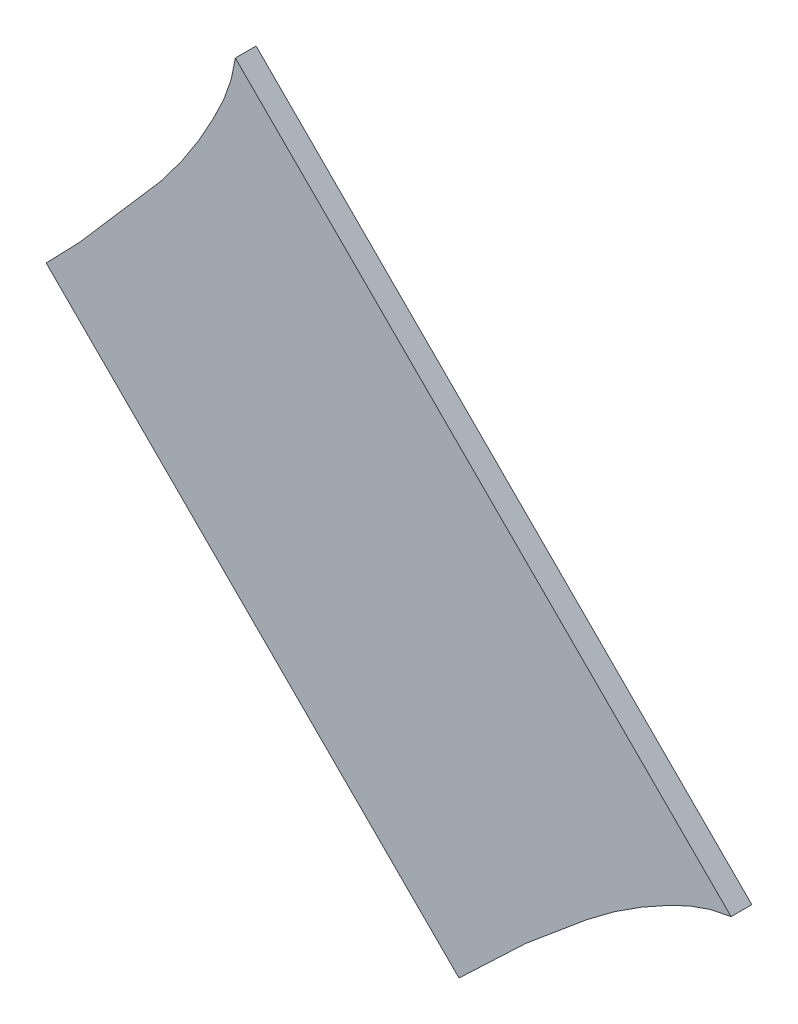
ISO-10303-21;
HEADER;
FILE_DESCRIPTION(('STEP AP214'),'2;1');
FILE_NAME('part.step','',(''),(''),'','','');
FILE_SCHEMA(('AUTOMOTIVE_DESIGN { 1 0 10303 214 1 1 1 1 }'));
ENDSEC;
DATA;
#1=APPLICATION_CONTEXT('core data for automotive mechanical design processes');
#2=APPLICATION_PROTOCOL_DEFINITION('international standard','automotive_design',2000,#1);
#3=PRODUCT_CONTEXT('',#1,'mechanical');
#4=PRODUCT('Part','Part','',(#3));
#5=PRODUCT_RELATED_PRODUCT_CATEGORY('part','',(#4));
#6=PRODUCT_DEFINITION_FORMATION('','',#4);
#7=PRODUCT_DEFINITION_CONTEXT('part definition',#1,'design');
#8=PRODUCT_DEFINITION('design','',#6,#7);
#9=PRODUCT_DEFINITION_SHAPE('','',#8);
#10=(LENGTH_UNIT() NAMED_UNIT(*) SI_UNIT(.MILLI.,.METRE.));
#11=(NAMED_UNIT(*) PLANE_ANGLE_UNIT() SI_UNIT($,.RADIAN.));
#12=(NAMED_UNIT(*) SI_UNIT($,.STERADIAN.) SOLID_ANGLE_UNIT());
#13=UNCERTAINTY_MEASURE_WITH_UNIT(LENGTH_MEASURE(1.E-05),#10,'distance_accuracy_value','');
#14=(GEOMETRIC_REPRESENTATION_CONTEXT(3) GLOBAL_UNCERTAINTY_ASSIGNED_CONTEXT((#13)) GLOBAL_UNIT_ASSIGNED_CONTEXT((#10,
#11,#12)) REPRESENTATION_CONTEXT('',''));
#15=CARTESIAN_POINT('',(0.,0.,0.));
#16=DIRECTION('',(0.,0.,1.));
#17=DIRECTION('',(1.,0.,0.));
#18=AXIS2_PLACEMENT_3D('',#15,#16,#17);
#19=CARTESIAN_POINT('',(87.5400009155273,42.4729995727539,0.));
#20=DIRECTION('',(-0.687930269545773,0.72577678678963,0.));
#21=DIRECTION('',(0.72577678678963,0.687930269545773,0.));
#22=AXIS2_PLACEMENT_3D('',#19,#20,#21);
#23=PLANE('',#22);
#24=DIRECTION('',(0.72577678678963,0.687930269545773,0.));
#25=VECTOR('',#24,1.);
#26=CARTESIAN_POINT('',(87.5400009155273,42.4729995727539,0.03556));
#27=LINE('',#26,#25);
#28=CARTESIAN_POINT('',(87.5400009155273,42.4729995727539,0.03556));
#29=VERTEX_POINT('',#28);
#30=CARTESIAN_POINT('',(87.6549987792969,42.5820007324219,0.03556));
#31=VERTEX_POINT('',#30);
#32=EDGE_CURVE('E11',#29,#31,#27,.T.);
#33=ORIENTED_EDGE('',*,*,#32,.F.);
#34=DIRECTION('',(0.,0.,1.));
#35=VECTOR('',#34,1.);
#36=CARTESIAN_POINT('',(87.5400009155273,42.4729995727539,0.));
#37=LINE('',#36,#35);
#38=CARTESIAN_POINT('',(87.5400009155273,42.4729995727539,0.));
#39=VERTEX_POINT('',#38);
#40=EDGE_CURVE('E24',#39,#29,#37,.T.);
#41=ORIENTED_EDGE('',*,*,#40,.F.);
#42=DIRECTION('',(0.72577678678963,0.687930269545773,0.));
#43=VECTOR('',#42,1.);
#44=CARTESIAN_POINT('',(87.5400009155273,42.4729995727539,0.));
#45=LINE('',#44,#43);
#46=CARTESIAN_POINT('',(87.6549987792969,42.5820007324219,0.));
#47=VERTEX_POINT('',#46);
#48=EDGE_CURVE('E160',#39,#47,#45,.T.);
#49=ORIENTED_EDGE('',*,*,#48,.T.);
#50=DIRECTION('',(0.,0.,1.));
#51=VECTOR('',#50,1.);
#52=CARTESIAN_POINT('',(87.6549987792969,42.5820007324219,0.));
#53=LINE('',#52,#51);
#54=EDGE_CURVE('E37',#47,#31,#53,.T.);
#55=ORIENTED_EDGE('',*,*,#54,.T.);
#56=EDGE_LOOP('',(#33,#41,#49,#55));
#57=FACE_BOUND('',#56,.T.);
#58=ADVANCED_FACE('F17',(#57),#23,.F.);
#59=CARTESIAN_POINT('',(87.6549987792969,42.5820007324219,0.));
#60=DIRECTION('',(-0.641611181094961,0.767030046539201,0.));
#61=DIRECTION('',(0.767030046539201,0.641611181094961,0.));
#62=AXIS2_PLACEMENT_3D('',#59,#60,#61);
#63=PLANE('',#62);
#64=DIRECTION('',(0.767030046539201,0.641611181094961,0.));
#65=VECTOR('',#64,1.);
#66=CARTESIAN_POINT('',(87.6549987792969,42.5820007324219,0.03556));
#67=LINE('',#66,#65);
#68=CARTESIAN_POINT('',(87.7590026855469,42.6689987182617,0.03556));
#69=VERTEX_POINT('',#68);
#70=EDGE_CURVE('E280',#31,#69,#67,.T.);
#71=ORIENTED_EDGE('',*,*,#70,.F.);
#72=ORIENTED_EDGE('',*,*,#54,.F.);
#73=DIRECTION('',(0.767030046539201,0.641611181094961,0.));
#74=VECTOR('',#73,1.);
#75=CARTESIAN_POINT('',(87.6549987792969,42.5820007324219,0.));
#76=LINE('',#75,#74);
#77=CARTESIAN_POINT('',(87.7590026855469,42.6689987182617,0.));
#78=VERTEX_POINT('',#77);
#79=EDGE_CURVE('E277',#47,#78,#76,.T.);
#80=ORIENTED_EDGE('',*,*,#79,.T.);
#81=DIRECTION('',(0.,0.,1.));
#82=VECTOR('',#81,1.);
#83=CARTESIAN_POINT('',(87.7590026855469,42.6689987182617,0.));
#84=LINE('',#83,#82);
#85=EDGE_CURVE('E275',#78,#69,#84,.T.);
#86=ORIENTED_EDGE('',*,*,#85,.T.);
#87=EDGE_LOOP('',(#71,#72,#80,#86));
#88=FACE_BOUND('',#87,.T.);
#89=ADVANCED_FACE('F288',(#88),#63,.F.);
#90=CARTESIAN_POINT('',(87.7590026855469,42.6689987182617,0.));
#91=DIRECTION('',(-0.600061034341126,0.799954220606066,0.));
#92=DIRECTION('',(0.799954220606066,0.600061034341126,0.));
#93=AXIS2_PLACEMENT_3D('',#90,#91,#92);
#94=PLANE('',#93);
#95=DIRECTION('',(0.799954220606066,0.600061034341126,0.));
#96=VECTOR('',#95,1.);
#97=CARTESIAN_POINT('',(87.7590026855469,42.6689987182617,0.03556));
#98=LINE('',#97,#96);
#99=CARTESIAN_POINT('',(87.806999206543,42.7050018310547,0.03556));
#100=VERTEX_POINT('',#99);
#101=EDGE_CURVE('E272',#69,#100,#98,.T.);
#102=ORIENTED_EDGE('',*,*,#101,.F.);
#103=ORIENTED_EDGE('',*,*,#85,.F.);
#104=DIRECTION('',(0.799954220606066,0.600061034341126,0.));
#105=VECTOR('',#104,1.);
#106=CARTESIAN_POINT('',(87.7590026855469,42.6689987182617,0.));
#107=LINE('',#106,#105);
#108=CARTESIAN_POINT('',(87.806999206543,42.7050018310547,0.));
#109=VERTEX_POINT('',#108);
#110=EDGE_CURVE('E269',#78,#109,#107,.T.);
#111=ORIENTED_EDGE('',*,*,#110,.T.);
#112=DIRECTION('',(0.,0.,1.));
#113=VECTOR('',#112,1.);
#114=CARTESIAN_POINT('',(87.806999206543,42.7050018310547,0.));
#115=LINE('',#114,#113);
#116=EDGE_CURVE('E267',#109,#100,#115,.T.);
#117=ORIENTED_EDGE('',*,*,#116,.T.);
#118=EDGE_LOOP('',(#102,#103,#111,#117));
#119=FACE_BOUND('',#118,.T.);
#120=ADVANCED_FACE('F294',(#119),#94,.F.);
#121=CARTESIAN_POINT('',(87.806999206543,42.7050018310547,0.));
#122=DIRECTION('',(-0.541708046838841,0.840566708828067,0.));
#123=DIRECTION('',(0.840566708828067,0.541708046838841,0.));
#124=AXIS2_PLACEMENT_3D('',#121,#122,#123);
#125=PLANE('',#124);
#126=DIRECTION('',(0.840566708828067,0.541708046838841,0.));
#127=VECTOR('',#126,1.);
#128=CARTESIAN_POINT('',(87.806999206543,42.7050018310547,0.03556));
#129=LINE('',#128,#127);
#130=CARTESIAN_POINT('',(87.8519973754883,42.734001159668,0.03556));
#131=VERTEX_POINT('',#130);
#132=EDGE_CURVE('E264',#100,#131,#129,.T.);
#133=ORIENTED_EDGE('',*,*,#132,.F.);
#134=ORIENTED_EDGE('',*,*,#116,.F.);
#135=DIRECTION('',(0.840566708828067,0.541708046838841,0.));
#136=VECTOR('',#135,1.);
#137=CARTESIAN_POINT('',(87.806999206543,42.7050018310547,0.));
#138=LINE('',#137,#136);
#139=CARTESIAN_POINT('',(87.8519973754883,42.734001159668,0.));
#140=VERTEX_POINT('',#139);
#141=EDGE_CURVE('E261',#109,#140,#138,.T.);
#142=ORIENTED_EDGE('',*,*,#141,.T.);
#143=DIRECTION('',(0.,0.,1.));
#144=VECTOR('',#143,1.);
#145=CARTESIAN_POINT('',(87.8519973754883,42.734001159668,0.));
#146=LINE('',#145,#144);
#147=EDGE_CURVE('E259',#140,#131,#146,.T.);
#148=ORIENTED_EDGE('',*,*,#147,.T.);
#149=EDGE_LOOP('',(#133,#134,#142,#148));
#150=FACE_BOUND('',#149,.T.);
#151=ADVANCED_FACE('F296',(#150),#125,.F.);
#152=CARTESIAN_POINT('',(87.8519973754883,42.734001159668,0.));
#153=DIRECTION('',(-0.487345554475913,0.873209202042996,0.));
#154=DIRECTION('',(0.873209202042996,0.487345554475913,0.));
#155=AXIS2_PLACEMENT_3D('',#152,#153,#154);
#156=PLANE('',#155);
#157=DIRECTION('',(0.873209202042996,0.487345554475913,0.));
#158=VECTOR('',#157,1.);
#159=CARTESIAN_POINT('',(87.8519973754883,42.734001159668,0.03556));
#160=LINE('',#159,#158);
#161=CARTESIAN_POINT('',(87.8949966430664,42.757999420166,0.03556));
#162=VERTEX_POINT('',#161);
#163=EDGE_CURVE('E256',#131,#162,#160,.T.);
#164=ORIENTED_EDGE('',*,*,#163,.F.);
#165=ORIENTED_EDGE('',*,*,#147,.F.);
#166=DIRECTION('',(0.873209202042996,0.487345554475913,0.));
#167=VECTOR('',#166,1.);
#168=CARTESIAN_POINT('',(87.8519973754883,42.734001159668,0.));
#169=LINE('',#168,#167);
#170=CARTESIAN_POINT('',(87.8949966430664,42.757999420166,0.));
#171=VERTEX_POINT('',#170);
#172=EDGE_CURVE('E253',#140,#171,#169,.T.);
#173=ORIENTED_EDGE('',*,*,#172,.T.);
#174=DIRECTION('',(0.,0.,1.));
#175=VECTOR('',#174,1.);
#176=CARTESIAN_POINT('',(87.8949966430664,42.757999420166,0.));
#177=LINE('',#176,#175);
#178=EDGE_CURVE('E251',#171,#162,#177,.T.);
#179=ORIENTED_EDGE('',*,*,#178,.T.);
#180=EDGE_LOOP('',(#164,#165,#173,#179));
#181=FACE_BOUND('',#180,.T.);
#182=ADVANCED_FACE('F301',(#181),#156,.F.);
#183=CARTESIAN_POINT('',(87.8949966430664,42.757999420166,0.));
#184=DIRECTION('',(-0.437974889640196,0.898987205718001,0.));
#185=DIRECTION('',(0.898987205718001,0.437974889640196,0.));
#186=AXIS2_PLACEMENT_3D('',#183,#184,#185);
#187=PLANE('',#186);
#188=DIRECTION('',(0.898987205718,0.437974889640196,0.));
#189=VECTOR('',#188,1.);
#190=CARTESIAN_POINT('',(87.8949966430664,42.757999420166,0.03556));
#191=LINE('',#190,#189);
#192=CARTESIAN_POINT('',(87.9339981079101,42.7770004272461,0.03556));
#193=VERTEX_POINT('',#192);
#194=EDGE_CURVE('E248',#162,#193,#191,.T.);
#195=ORIENTED_EDGE('',*,*,#194,.F.);
#196=ORIENTED_EDGE('',*,*,#178,.F.);
#197=DIRECTION('',(0.898987205718,0.437974889640196,0.));
#198=VECTOR('',#197,1.);
#199=CARTESIAN_POINT('',(87.8949966430664,42.757999420166,0.));
#200=LINE('',#199,#198);
#201=CARTESIAN_POINT('',(87.9339981079101,42.7770004272461,0.));
#202=VERTEX_POINT('',#201);
#203=EDGE_CURVE('E245',#171,#202,#200,.T.);
#204=ORIENTED_EDGE('',*,*,#203,.T.);
#205=DIRECTION('',(0.,0.,1.));
#206=VECTOR('',#205,1.);
#207=CARTESIAN_POINT('',(87.9339981079101,42.7770004272461,0.));
#208=LINE('',#207,#206);
#209=EDGE_CURVE('E243',#202,#193,#208,.T.);
#210=ORIENTED_EDGE('',*,*,#209,.T.);
#211=EDGE_LOOP('',(#195,#196,#204,#210));
#212=FACE_BOUND('',#211,.T.);
#213=ADVANCED_FACE('F304',(#212),#187,.F.);
#214=CARTESIAN_POINT('',(87.9339981079101,42.7770004272461,0.));
#215=DIRECTION('',(-0.331476635365494,0.943463428123619,0.));
#216=DIRECTION('',(0.943463428123619,0.331476635365494,0.));
#217=AXIS2_PLACEMENT_3D('',#214,#215,#216);
#218=PLANE('',#217);
#219=DIRECTION('',(0.943463428123619,0.331476635365494,0.));
#220=VECTOR('',#219,1.);
#221=CARTESIAN_POINT('',(87.9339981079101,42.7770004272461,0.03556));
#222=LINE('',#221,#220);
#223=CARTESIAN_POINT('',(87.9710006713867,42.7900009155273,0.03556));
#224=VERTEX_POINT('',#223);
#225=EDGE_CURVE('E240',#193,#224,#222,.T.);
#226=ORIENTED_EDGE('',*,*,#225,.F.);
#227=ORIENTED_EDGE('',*,*,#209,.F.);
#228=DIRECTION('',(0.943463428123619,0.331476635365494,0.));
#229=VECTOR('',#228,1.);
#230=CARTESIAN_POINT('',(87.9339981079101,42.7770004272461,0.));
#231=LINE('',#230,#229);
#232=CARTESIAN_POINT('',(87.9710006713867,42.7900009155273,0.));
#233=VERTEX_POINT('',#232);
#234=EDGE_CURVE('E237',#202,#233,#231,.T.);
#235=ORIENTED_EDGE('',*,*,#234,.T.);
#236=DIRECTION('',(0.,0.,1.));
#237=VECTOR('',#236,1.);
#238=CARTESIAN_POINT('',(87.9710006713867,42.7900009155273,0.));
#239=LINE('',#238,#237);
#240=EDGE_CURVE('E235',#233,#224,#239,.T.);
#241=ORIENTED_EDGE('',*,*,#240,.T.);
#242=EDGE_LOOP('',(#226,#227,#235,#241));
#243=FACE_BOUND('',#242,.T.);
#244=ADVANCED_FACE('F309',(#243),#218,.F.);
#245=CARTESIAN_POINT('',(87.9710006713867,42.7900009155273,0.));
#246=DIRECTION('',(-0.19613669018734,0.980576564457032,0.));
#247=DIRECTION('',(0.980576564457032,0.19613669018734,0.));
#248=AXIS2_PLACEMENT_3D('',#245,#246,#247);
#249=PLANE('',#248);
#250=DIRECTION('',(0.980576564457032,0.19613669018734,0.));
#251=VECTOR('',#250,1.);
#252=CARTESIAN_POINT('',(87.9710006713867,42.7900009155273,0.03556));
#253=LINE('',#252,#251);
#254=CARTESIAN_POINT('',(88.0059967041016,42.7970008850098,0.03556));
#255=VERTEX_POINT('',#254);
#256=EDGE_CURVE('E232',#224,#255,#253,.T.);
#257=ORIENTED_EDGE('',*,*,#256,.F.);
#258=ORIENTED_EDGE('',*,*,#240,.F.);
#259=DIRECTION('',(0.980576564457032,0.19613669018734,0.));
#260=VECTOR('',#259,1.);
#261=CARTESIAN_POINT('',(87.9710006713867,42.7900009155273,0.));
#262=LINE('',#261,#260);
#263=CARTESIAN_POINT('',(88.0059967041016,42.7970008850098,0.));
#264=VERTEX_POINT('',#263);
#265=EDGE_CURVE('E229',#233,#264,#262,.T.);
#266=ORIENTED_EDGE('',*,*,#265,.T.);
#267=DIRECTION('',(0.,0.,1.));
#268=VECTOR('',#267,1.);
#269=CARTESIAN_POINT('',(88.0059967041016,42.7970008850098,0.));
#270=LINE('',#269,#268);
#271=EDGE_CURVE('E227',#264,#255,#270,.T.);
#272=ORIENTED_EDGE('',*,*,#271,.T.);
#273=EDGE_LOOP('',(#257,#258,#266,#272));
#274=FACE_BOUND('',#273,.T.);
#275=ADVANCED_FACE('F312',(#274),#249,.F.);
#276=CARTESIAN_POINT('',(88.0059967041016,42.7970008850098,0.));
#277=DIRECTION('',(-0.707106781186548,-0.707106781186548,0.));
#278=DIRECTION('',(-0.707106781186548,0.707106781186548,0.));
#279=AXIS2_PLACEMENT_3D('',#276,#277,#278);
#280=PLANE('',#279);
#281=DIRECTION('',(-0.707106781186548,0.707106781186548,0.));
#282=VECTOR('',#281,1.);
#283=CARTESIAN_POINT('',(88.0059967041016,42.7970008850098,0.03556));
#284=LINE('',#283,#282);
#285=CARTESIAN_POINT('',(87.1569976806641,43.6459999084473,0.03556));
#286=VERTEX_POINT('',#285);
#287=EDGE_CURVE('E224',#255,#286,#284,.T.);
#288=ORIENTED_EDGE('',*,*,#287,.F.);
#289=ORIENTED_EDGE('',*,*,#271,.F.);
#290=DIRECTION('',(-0.707106781186548,0.707106781186548,0.));
#291=VECTOR('',#290,1.);
#292=CARTESIAN_POINT('',(88.0059967041016,42.7970008850098,0.));
#293=LINE('',#292,#291);
#294=CARTESIAN_POINT('',(87.1569976806641,43.6459999084473,0.));
#295=VERTEX_POINT('',#294);
#296=EDGE_CURVE('E221',#264,#295,#293,.T.);
#297=ORIENTED_EDGE('',*,*,#296,.T.);
#298=DIRECTION('',(0.,0.,1.));
#299=VECTOR('',#298,1.);
#300=CARTESIAN_POINT('',(87.1569976806641,43.6459999084473,0.));
#301=LINE('',#300,#299);
#302=EDGE_CURVE('E219',#295,#286,#301,.T.);
#303=ORIENTED_EDGE('',*,*,#302,.T.);
#304=EDGE_LOOP('',(#288,#289,#297,#303));
#305=FACE_BOUND('',#304,.T.);
#306=ADVANCED_FACE('F317',(#305),#280,.F.);
#307=CARTESIAN_POINT('',(87.1569976806641,43.6459999084473,0.));
#308=DIRECTION('',(0.980601223674596,-0.196013367217353,0.));
#309=DIRECTION('',(-0.196013367217353,-0.980601223674596,0.));
#310=AXIS2_PLACEMENT_3D('',#307,#308,#309);
#311=PLANE('',#310);
#312=DIRECTION('',(-0.196013367217353,-0.980601223674596,0.));
#313=VECTOR('',#312,1.);
#314=CARTESIAN_POINT('',(87.1569976806641,43.6459999084473,0.03556));
#315=LINE('',#314,#313);
#316=CARTESIAN_POINT('',(87.1500015258789,43.6110000610351,0.03556));
#317=VERTEX_POINT('',#316);
#318=EDGE_CURVE('E216',#286,#317,#315,.T.);
#319=ORIENTED_EDGE('',*,*,#318,.F.);
#320=ORIENTED_EDGE('',*,*,#302,.F.);
#321=DIRECTION('',(-0.196013367217353,-0.980601223674596,0.));
#322=VECTOR('',#321,1.);
#323=CARTESIAN_POINT('',(87.1569976806641,43.6459999084473,0.));
#324=LINE('',#323,#322);
#325=CARTESIAN_POINT('',(87.1500015258789,43.6110000610351,0.));
#326=VERTEX_POINT('',#325);
#327=EDGE_CURVE('E213',#295,#326,#324,.T.);
#328=ORIENTED_EDGE('',*,*,#327,.T.);
#329=DIRECTION('',(0.,0.,1.));
#330=VECTOR('',#329,1.);
#331=CARTESIAN_POINT('',(87.1500015258789,43.6110000610351,0.));
#332=LINE('',#331,#330);
#333=EDGE_CURVE('E211',#326,#317,#332,.T.);
#334=ORIENTED_EDGE('',*,*,#333,.T.);
#335=EDGE_LOOP('',(#319,#320,#328,#334));
#336=FACE_BOUND('',#335,.T.);
#337=ADVANCED_FACE('F320',(#336),#311,.F.);
#338=CARTESIAN_POINT('',(87.1500015258789,43.6110000610352,0.));
#339=DIRECTION('',(0.943452739569455,-0.331507056031828,0.));
#340=DIRECTION('',(-0.331507056031828,-0.943452739569455,0.));
#341=AXIS2_PLACEMENT_3D('',#338,#339,#340);
#342=PLANE('',#341);
#343=DIRECTION('',(-0.331507056031828,-0.943452739569455,0.));
#344=VECTOR('',#343,1.);
#345=CARTESIAN_POINT('',(87.1500015258789,43.6110000610351,0.03556));
#346=LINE('',#345,#344);
#347=CARTESIAN_POINT('',(87.1370010375977,43.5740013122559,0.03556));
#348=VERTEX_POINT('',#347);
#349=EDGE_CURVE('E208',#317,#348,#346,.T.);
#350=ORIENTED_EDGE('',*,*,#349,.F.);
#351=ORIENTED_EDGE('',*,*,#333,.F.);
#352=DIRECTION('',(-0.331507056031828,-0.943452739569455,0.));
#353=VECTOR('',#352,1.);
#354=CARTESIAN_POINT('',(87.1500015258789,43.6110000610351,0.));
#355=LINE('',#354,#353);
#356=CARTESIAN_POINT('',(87.1370010375977,43.5740013122559,0.));
#357=VERTEX_POINT('',#356);
#358=EDGE_CURVE('E205',#326,#357,#355,.T.);
#359=ORIENTED_EDGE('',*,*,#358,.T.);
#360=DIRECTION('',(0.,0.,1.));
#361=VECTOR('',#360,1.);
#362=CARTESIAN_POINT('',(87.1370010375977,43.5740013122559,0.));
#363=LINE('',#362,#361);
#364=EDGE_CURVE('E203',#357,#348,#363,.T.);
#365=ORIENTED_EDGE('',*,*,#364,.T.);
#366=EDGE_LOOP('',(#350,#351,#359,#365));
#367=FACE_BOUND('',#366,.T.);
#368=ADVANCED_FACE('F325',(#367),#342,.F.);
#369=CARTESIAN_POINT('',(87.1370010375977,43.5740013122559,0.));
#370=DIRECTION('',(0.898952583578913,-0.438045947905922,0.));
#371=DIRECTION('',(-0.438045947905922,-0.898952583578913,0.));
#372=AXIS2_PLACEMENT_3D('',#369,#370,#371);
#373=PLANE('',#372);
#374=DIRECTION('',(-0.438045947905922,-0.898952583578913,0.));
#375=VECTOR('',#374,1.);
#376=CARTESIAN_POINT('',(87.1370010375977,43.5740013122559,0.03556));
#377=LINE('',#376,#375);
#378=CARTESIAN_POINT('',(87.1179962158203,43.5349998474121,0.03556));
#379=VERTEX_POINT('',#378);
#380=EDGE_CURVE('E200',#348,#379,#377,.T.);
#381=ORIENTED_EDGE('',*,*,#380,.F.);
#382=ORIENTED_EDGE('',*,*,#364,.F.);
#383=DIRECTION('',(-0.438045947905922,-0.898952583578913,0.));
#384=VECTOR('',#383,1.);
#385=CARTESIAN_POINT('',(87.1370010375977,43.5740013122559,0.));
#386=LINE('',#385,#384);
#387=CARTESIAN_POINT('',(87.1179962158203,43.5349998474121,0.));
#388=VERTEX_POINT('',#387);
#389=EDGE_CURVE('E197',#357,#388,#386,.T.);
#390=ORIENTED_EDGE('',*,*,#389,.T.);
#391=DIRECTION('',(0.,0.,1.));
#392=VECTOR('',#391,1.);
#393=CARTESIAN_POINT('',(87.1179962158203,43.5349998474121,0.));
#394=LINE('',#393,#392);
#395=EDGE_CURVE('E195',#388,#379,#394,.T.);
#396=ORIENTED_EDGE('',*,*,#395,.T.);
#397=EDGE_LOOP('',(#381,#382,#390,#396));
#398=FACE_BOUND('',#397,.T.);
#399=ADVANCED_FACE('F328',(#398),#373,.F.);
#400=CARTESIAN_POINT('',(87.1179962158203,43.5349998474121,0.));
#401=DIRECTION('',(0.873242167774009,-0.48728648290441,0.));
#402=DIRECTION('',(-0.48728648290441,-0.873242167774009,0.));
#403=AXIS2_PLACEMENT_3D('',#400,#401,#402);
#404=PLANE('',#403);
#405=DIRECTION('',(-0.48728648290441,-0.873242167774009,0.));
#406=VECTOR('',#405,1.);
#407=CARTESIAN_POINT('',(87.1179962158203,43.5349998474121,0.03556));
#408=LINE('',#407,#406);
#409=CARTESIAN_POINT('',(87.0940017700195,43.492000579834,0.03556));
#410=VERTEX_POINT('',#409);
#411=EDGE_CURVE('E192',#379,#410,#408,.T.);
#412=ORIENTED_EDGE('',*,*,#411,.F.);
#413=ORIENTED_EDGE('',*,*,#395,.F.);
#414=DIRECTION('',(-0.48728648290441,-0.873242167774009,0.));
#415=VECTOR('',#414,1.);
#416=CARTESIAN_POINT('',(87.1179962158203,43.5349998474121,0.));
#417=LINE('',#416,#415);
#418=CARTESIAN_POINT('',(87.0940017700195,43.492000579834,0.));
#419=VERTEX_POINT('',#418);
#420=EDGE_CURVE('E189',#388,#419,#417,.T.);
#421=ORIENTED_EDGE('',*,*,#420,.T.);
#422=DIRECTION('',(0.,0.,1.));
#423=VECTOR('',#422,1.);
#424=CARTESIAN_POINT('',(87.0940017700195,43.492000579834,0.));
#425=LINE('',#424,#423);
#426=EDGE_CURVE('E187',#419,#410,#425,.T.);
#427=ORIENTED_EDGE('',*,*,#426,.T.);
#428=EDGE_LOOP('',(#412,#413,#421,#427));
#429=FACE_BOUND('',#428,.T.);
#430=ADVANCED_FACE('F333',(#429),#404,.F.);
#431=CARTESIAN_POINT('',(87.0940017700195,43.492000579834,0.));
#432=DIRECTION('',(0.84058761762172,-0.541675601352913,0.));
#433=DIRECTION('',(-0.541675601352913,-0.84058761762172,0.));
#434=AXIS2_PLACEMENT_3D('',#431,#432,#433);
#435=PLANE('',#434);
#436=DIRECTION('',(-0.541675601352913,-0.84058761762172,0.));
#437=VECTOR('',#436,1.);
#438=CARTESIAN_POINT('',(87.0940017700195,43.492000579834,0.03556));
#439=LINE('',#438,#437);
#440=CARTESIAN_POINT('',(87.0650024414062,43.4469985961914,0.03556));
#441=VERTEX_POINT('',#440);
#442=EDGE_CURVE('E184',#410,#441,#439,.T.);
#443=ORIENTED_EDGE('',*,*,#442,.F.);
#444=ORIENTED_EDGE('',*,*,#426,.F.);
#445=DIRECTION('',(-0.541675601352913,-0.84058761762172,0.));
#446=VECTOR('',#445,1.);
#447=CARTESIAN_POINT('',(87.0940017700195,43.492000579834,0.));
#448=LINE('',#447,#446);
#449=CARTESIAN_POINT('',(87.0650024414062,43.4469985961914,0.));
#450=VERTEX_POINT('',#449);
#451=EDGE_CURVE('E181',#419,#450,#448,.T.);
#452=ORIENTED_EDGE('',*,*,#451,.T.);
#453=DIRECTION('',(0.,0.,1.));
#454=VECTOR('',#453,1.);
#455=CARTESIAN_POINT('',(87.0650024414062,43.4469985961914,0.));
#456=LINE('',#455,#454);
#457=EDGE_CURVE('E179',#450,#441,#456,.T.);
#458=ORIENTED_EDGE('',*,*,#457,.T.);
#459=EDGE_LOOP('',(#443,#444,#452,#458));
#460=FACE_BOUND('',#459,.T.);
#461=ADVANCED_FACE('F336',(#460),#435,.F.);
#462=CARTESIAN_POINT('',(87.0650024414062,43.4469985961914,0.));
#463=DIRECTION('',(0.799977112049266,-0.600030516055072,0.));
#464=DIRECTION('',(-0.600030516055072,-0.799977112049266,0.));
#465=AXIS2_PLACEMENT_3D('',#462,#463,#464);
#466=PLANE('',#465);
#467=DIRECTION('',(-0.600030516055072,-0.799977112049266,0.));
#468=VECTOR('',#467,1.);
#469=CARTESIAN_POINT('',(87.0650024414062,43.4469985961914,0.03556));
#470=LINE('',#469,#468);
#471=CARTESIAN_POINT('',(87.0289993286133,43.398998260498,0.03556));
#472=VERTEX_POINT('',#471);
#473=EDGE_CURVE('E176',#441,#472,#470,.T.);
#474=ORIENTED_EDGE('',*,*,#473,.F.);
#475=ORIENTED_EDGE('',*,*,#457,.F.);
#476=DIRECTION('',(-0.600030516055072,-0.799977112049266,0.));
#477=VECTOR('',#476,1.);
#478=CARTESIAN_POINT('',(87.0650024414062,43.4469985961914,0.));
#479=LINE('',#478,#477);
#480=CARTESIAN_POINT('',(87.0289993286133,43.398998260498,0.));
#481=VERTEX_POINT('',#480);
#482=EDGE_CURVE('E173',#450,#481,#479,.T.);
#483=ORIENTED_EDGE('',*,*,#482,.T.);
#484=DIRECTION('',(0.,0.,1.));
#485=VECTOR('',#484,1.);
#486=CARTESIAN_POINT('',(87.0289993286133,43.398998260498,0.));
#487=LINE('',#486,#485);
#488=EDGE_CURVE('E171',#481,#472,#487,.T.);
#489=ORIENTED_EDGE('',*,*,#488,.T.);
#490=EDGE_LOOP('',(#474,#475,#483,#489));
#491=FACE_BOUND('',#490,.T.);
#492=ADVANCED_FACE('F341',(#491),#466,.F.);
#493=CARTESIAN_POINT('',(87.0289993286133,43.398998260498,0.));
#494=DIRECTION('',(0.754910000638264,-0.655828400525882,0.));
#495=DIRECTION('',(-0.655828400525882,-0.754910000638264,0.));
#496=AXIS2_PLACEMENT_3D('',#493,#494,#495);
#497=PLANE('',#496);
#498=DIRECTION('',(-0.655828400525882,-0.754910000638264,0.));
#499=VECTOR('',#498,1.);
#500=CARTESIAN_POINT('',(87.0289993286133,43.398998260498,0.03556));
#501=LINE('',#500,#499);
#502=CARTESIAN_POINT('',(86.8899993896484,43.2389984130859,0.03556));
#503=VERTEX_POINT('',#502);
#504=EDGE_CURVE('E168',#472,#503,#501,.T.);
#505=ORIENTED_EDGE('',*,*,#504,.F.);
#506=ORIENTED_EDGE('',*,*,#488,.F.);
#507=DIRECTION('',(-0.655828400525882,-0.754910000638264,0.));
#508=VECTOR('',#507,1.);
#509=CARTESIAN_POINT('',(87.0289993286133,43.398998260498,0.));
#510=LINE('',#509,#508);
#511=CARTESIAN_POINT('',(86.8899993896484,43.2389984130859,0.));
#512=VERTEX_POINT('',#511);
#513=EDGE_CURVE('E166',#481,#512,#510,.T.);
#514=ORIENTED_EDGE('',*,*,#513,.T.);
#515=DIRECTION('',(0.,0.,1.));
#516=VECTOR('',#515,1.);
#517=CARTESIAN_POINT('',(86.8899993896484,43.2389984130859,0.));
#518=LINE('',#517,#516);
#519=EDGE_CURVE('E151',#512,#503,#518,.T.);
#520=ORIENTED_EDGE('',*,*,#519,.T.);
#521=EDGE_LOOP('',(#505,#506,#514,#520));
#522=FACE_BOUND('',#521,.T.);
#523=ADVANCED_FACE('F343',(#522),#497,.F.);
#524=CARTESIAN_POINT('',(86.8899993896484,43.2389984130859,0.));
#525=DIRECTION('',(0.71918508857693,-0.694818543483544,0.));
#526=DIRECTION('',(-0.694818543483544,-0.71918508857693,0.));
#527=AXIS2_PLACEMENT_3D('',#524,#525,#526);
#528=PLANE('',#527);
#529=DIRECTION('',(-0.694818543483544,-0.71918508857693,0.));
#530=VECTOR('',#529,1.);
#531=CARTESIAN_POINT('',(86.8899993896484,43.2389984130859,0.03556));
#532=LINE('',#531,#530);
#533=CARTESIAN_POINT('',(86.8330001831055,43.1800003051758,0.03556));
#534=VERTEX_POINT('',#533);
#535=EDGE_CURVE('E155',#503,#534,#532,.T.);
#536=ORIENTED_EDGE('',*,*,#535,.F.);
#537=ORIENTED_EDGE('',*,*,#519,.F.);
#538=DIRECTION('',(-0.694818543483544,-0.71918508857693,0.));
#539=VECTOR('',#538,1.);
#540=CARTESIAN_POINT('',(86.8899993896484,43.2389984130859,0.));
#541=LINE('',#540,#539);
#542=CARTESIAN_POINT('',(86.8330001831055,43.1800003051758,0.));
#543=VERTEX_POINT('',#542);
#544=EDGE_CURVE('E147',#512,#543,#541,.T.);
#545=ORIENTED_EDGE('',*,*,#544,.T.);
#546=DIRECTION('',(0.,0.,1.));
#547=VECTOR('',#546,1.);
#548=CARTESIAN_POINT('',(86.8330001831055,43.1800003051758,0.));
#549=LINE('',#548,#547);
#550=EDGE_CURVE('E137',#543,#534,#549,.T.);
#551=ORIENTED_EDGE('',*,*,#550,.T.);
#552=EDGE_LOOP('',(#536,#537,#545,#551));
#553=FACE_BOUND('',#552,.T.);
#554=ADVANCED_FACE('F150',(#553),#528,.F.);
#555=CARTESIAN_POINT('',(86.8330001831055,43.1800003051758,0.));
#556=DIRECTION('',(0.707106781186548,0.707106781186548,0.));
#557=DIRECTION('',(0.707106781186548,-0.707106781186548,0.));
#558=AXIS2_PLACEMENT_3D('',#555,#556,#557);
#559=PLANE('',#558);
#560=DIRECTION('',(0.707106781186548,-0.707106781186548,0.));
#561=VECTOR('',#560,1.);
#562=CARTESIAN_POINT('',(86.8330001831055,43.1800003051758,0.03556));
#563=LINE('',#562,#561);
#564=EDGE_CURVE('E143',#534,#29,#563,.T.);
#565=ORIENTED_EDGE('',*,*,#564,.F.);
#566=ORIENTED_EDGE('',*,*,#550,.F.);
#567=DIRECTION('',(0.707106781186548,-0.707106781186548,0.));
#568=VECTOR('',#567,1.);
#569=CARTESIAN_POINT('',(86.8330001831055,43.1800003051758,0.));
#570=LINE('',#569,#568);
#571=EDGE_CURVE('E141',#543,#39,#570,.T.);
#572=ORIENTED_EDGE('',*,*,#571,.T.);
#573=ORIENTED_EDGE('',*,*,#40,.T.);
#574=EDGE_LOOP('',(#565,#566,#572,#573));
#575=FACE_BOUND('',#574,.T.);
#576=ADVANCED_FACE('F139',(#575),#559,.F.);
#577=CARTESIAN_POINT('',(87.5400009155273,42.4729995727539,0.));
#578=DIRECTION('',(0.,0.,1.));
#579=DIRECTION('',(1.,0.,0.));
#580=AXIS2_PLACEMENT_3D('',#577,#578,#579);
#581=PLANE('',#580);
#582=ORIENTED_EDGE('',*,*,#571,.F.);
#583=ORIENTED_EDGE('',*,*,#544,.F.);
#584=ORIENTED_EDGE('',*,*,#513,.F.);
#585=ORIENTED_EDGE('',*,*,#482,.F.);
#586=ORIENTED_EDGE('',*,*,#451,.F.);
#587=ORIENTED_EDGE('',*,*,#420,.F.);
#588=ORIENTED_EDGE('',*,*,#389,.F.);
#589=ORIENTED_EDGE('',*,*,#358,.F.);
#590=ORIENTED_EDGE('',*,*,#327,.F.);
#591=ORIENTED_EDGE('',*,*,#296,.F.);
#592=ORIENTED_EDGE('',*,*,#265,.F.);
#593=ORIENTED_EDGE('',*,*,#234,.F.);
#594=ORIENTED_EDGE('',*,*,#203,.F.);
#595=ORIENTED_EDGE('',*,*,#172,.F.);
#596=ORIENTED_EDGE('',*,*,#141,.F.);
#597=ORIENTED_EDGE('',*,*,#110,.F.);
#598=ORIENTED_EDGE('',*,*,#79,.F.);
#599=ORIENTED_EDGE('',*,*,#48,.F.);
#600=EDGE_LOOP('',(#582,#583,#584,#585,#586,#587,#588,#589,#590,#591,#592,#593,#594,#595,#596,
#597,#598,#599));
#601=FACE_BOUND('',#600,.T.);
#602=ADVANCED_FACE('F158',(#601),#581,.F.);
#603=CARTESIAN_POINT('',(87.5400009155273,42.4729995727539,0.03556));
#604=DIRECTION('',(0.,0.,1.));
#605=DIRECTION('',(1.,0.,0.));
#606=AXIS2_PLACEMENT_3D('',#603,#604,#605);
#607=PLANE('',#606);
#608=ORIENTED_EDGE('',*,*,#32,.T.);
#609=ORIENTED_EDGE('',*,*,#70,.T.);
#610=ORIENTED_EDGE('',*,*,#101,.T.);
#611=ORIENTED_EDGE('',*,*,#132,.T.);
#612=ORIENTED_EDGE('',*,*,#163,.T.);
#613=ORIENTED_EDGE('',*,*,#194,.T.);
#614=ORIENTED_EDGE('',*,*,#225,.T.);
#615=ORIENTED_EDGE('',*,*,#256,.T.);
#616=ORIENTED_EDGE('',*,*,#287,.T.);
#617=ORIENTED_EDGE('',*,*,#318,.T.);
#618=ORIENTED_EDGE('',*,*,#349,.T.);
#619=ORIENTED_EDGE('',*,*,#380,.T.);
#620=ORIENTED_EDGE('',*,*,#411,.T.);
#621=ORIENTED_EDGE('',*,*,#442,.T.);
#622=ORIENTED_EDGE('',*,*,#473,.T.);
#623=ORIENTED_EDGE('',*,*,#504,.T.);
#624=ORIENTED_EDGE('',*,*,#535,.T.);
#625=ORIENTED_EDGE('',*,*,#564,.T.);
#626=EDGE_LOOP('',(#608,#609,#610,#611,#612,#613,#614,#615,#616,#617,#618,#619,#620,#621,#622,
#623,#624,#625));
#627=FACE_BOUND('',#626,.T.);
#628=ADVANCED_FACE('F291',(#627),#607,.T.);
#629=CLOSED_SHELL('',(#58,#89,#120,#151,#182,#213,#244,#275,#306,#337,#368,#399,#430,#461,#492,
#523,#554,#576,#602,#628));
#630=MANIFOLD_SOLID_BREP('B1',#629);
#631=ADVANCED_BREP_SHAPE_REPRESENTATION('',(#18,#630),#14);
#632=SHAPE_DEFINITION_REPRESENTATION(#9,#631);
ENDSEC;
END-ISO-10303-21;
